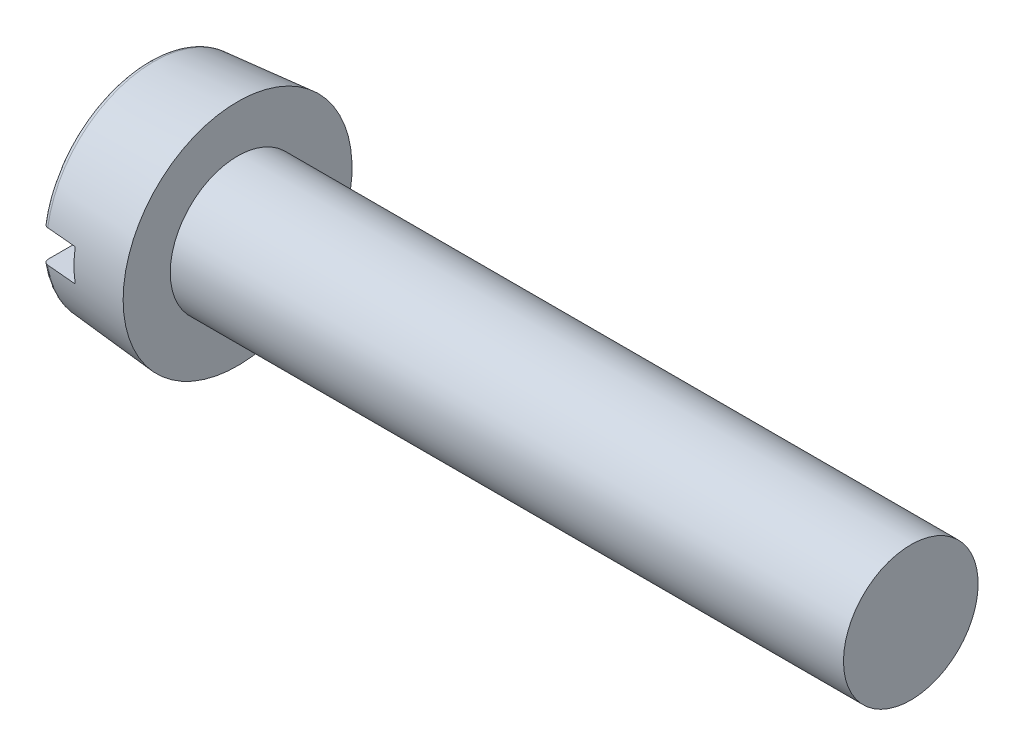
ISO-10303-21;
HEADER;
FILE_DESCRIPTION(('STEP AP214'),'2;1');
FILE_NAME('part.step','',(''),(''),'','','');
FILE_SCHEMA(('AUTOMOTIVE_DESIGN { 1 0 10303 214 1 1 1 1 }'));
ENDSEC;
DATA;
#1=APPLICATION_CONTEXT('core data for automotive mechanical design processes');
#2=APPLICATION_PROTOCOL_DEFINITION('international standard','automotive_design',2000,#1);
#3=PRODUCT_CONTEXT('',#1,'mechanical');
#4=PRODUCT('Part','Part','',(#3));
#5=PRODUCT_RELATED_PRODUCT_CATEGORY('part','',(#4));
#6=PRODUCT_DEFINITION_FORMATION('','',#4);
#7=PRODUCT_DEFINITION_CONTEXT('part definition',#1,'design');
#8=PRODUCT_DEFINITION('design','',#6,#7);
#9=PRODUCT_DEFINITION_SHAPE('','',#8);
#10=(LENGTH_UNIT() NAMED_UNIT(*) SI_UNIT(.MILLI.,.METRE.));
#11=(NAMED_UNIT(*) PLANE_ANGLE_UNIT() SI_UNIT($,.RADIAN.));
#12=(NAMED_UNIT(*) SI_UNIT($,.STERADIAN.) SOLID_ANGLE_UNIT());
#13=UNCERTAINTY_MEASURE_WITH_UNIT(LENGTH_MEASURE(1.E-05),#10,'distance_accuracy_value','');
#14=(GEOMETRIC_REPRESENTATION_CONTEXT(3) GLOBAL_UNCERTAINTY_ASSIGNED_CONTEXT((#13)) GLOBAL_UNIT_ASSIGNED_CONTEXT((#10,
#11,#12)) REPRESENTATION_CONTEXT('',''));
#15=CARTESIAN_POINT('',(0.,0.,0.));
#16=DIRECTION('',(0.,0.,1.));
#17=DIRECTION('',(1.,0.,0.));
#18=AXIS2_PLACEMENT_3D('',#15,#16,#17);
#19=CARTESIAN_POINT('',(0.,0.,0.));
#20=DIRECTION('',(-1.,0.,0.));
#21=DIRECTION('',(0.,0.,1.));
#22=AXIS2_PLACEMENT_3D('',#19,#20,#21);
#23=PLANE('',#22);
#24=DIRECTION('',(0.,0.,-1.));
#25=VECTOR('',#24,1.);
#26=CARTESIAN_POINT('',(0.,0.6,4.25));
#27=LINE('',#26,#25);
#28=CARTESIAN_POINT('',(0.,0.6,3.7300729219396));
#29=VERTEX_POINT('',#28);
#30=CARTESIAN_POINT('',(0.,0.6,-3.7300729219396));
#31=VERTEX_POINT('',#30);
#32=EDGE_CURVE('E107',#29,#31,#27,.T.);
#33=ORIENTED_EDGE('',*,*,#32,.F.);
#34=CARTESIAN_POINT('',(0.,0.,0.));
#35=DIRECTION('',(-1.,0.,0.));
#36=DIRECTION('',(0.,0.,1.));
#37=AXIS2_PLACEMENT_3D('',#34,#35,#36);
#38=CIRCLE('',#37,3.77802117556097);
#39=EDGE_CURVE('E109',#29,#31,#38,.T.);
#40=ORIENTED_EDGE('',*,*,#39,.T.);
#41=EDGE_LOOP('',(#33,#40));
#42=FACE_BOUND('',#41,.T.);
#43=ADVANCED_FACE('F38',(#42),#23,.T.);
#44=CARTESIAN_POINT('',(0.2,0.,0.));
#45=DIRECTION('',(-1.,0.,0.));
#46=DIRECTION('',(0.,0.,1.));
#47=AXIS2_PLACEMENT_3D('',#44,#45,#46);
#48=TOROIDAL_SURFACE('',#47,3.77802117556097,0.2);
#49=CARTESIAN_POINT('',(0.0612246387865015,0.6,-3.87587372657926));
#50=CARTESIAN_POINT('',(0.0692437686753912,0.6,-3.88369228056032));
#51=CARTESIAN_POINT('',(0.0779233060285452,0.6,-3.89084432861686));
#52=CARTESIAN_POINT('',(0.0963647371093723,0.6,-3.90359892074776));
#53=CARTESIAN_POINT('',(0.106127774849142,0.6,-3.90919980480116));
#54=CARTESIAN_POINT('',(0.126458056502604,0.6,-3.9186779090971));
#55=CARTESIAN_POINT('',(0.137025240149511,0.6,-3.9225552583614));
#56=CARTESIAN_POINT('',(0.158660455760603,0.6,-3.92846742757867));
#57=CARTESIAN_POINT('',(0.169728366633293,0.6,-3.93050269053124));
#58=CARTESIAN_POINT('',(0.191982910164277,0.6,-3.93266377300577));
#59=CARTESIAN_POINT('',(0.203168454374147,0.6,-3.93280080792452));
#60=CARTESIAN_POINT('',(0.22540313842355,0.6,-3.93119011051395));
#61=CARTESIAN_POINT('',(0.236452276636842,0.6,-3.92944235573598));
#62=CARTESIAN_POINT('',(0.258074076113257,0.6,-3.9241213274814));
#63=CARTESIAN_POINT('',(0.268647790704579,0.6,-3.92055233042282));
#64=CARTESIAN_POINT('',(0.289049953276454,0.6,-3.91169791603072));
#65=CARTESIAN_POINT('',(0.29887839185142,0.6,-3.90641247703967));
#66=CARTESIAN_POINT('',(0.317563075466742,0.6,-3.89425210131312));
#67=CARTESIAN_POINT('',(0.326414509930255,0.6,-3.88736977576277));
#68=CARTESIAN_POINT('',(0.342850589250194,0.6,-3.87223027231712));
#69=CARTESIAN_POINT('',(0.350435177228172,0.6,-3.86397303272459));
#70=CARTESIAN_POINT('',(0.364204576611067,0.6,-3.84623083323831));
#71=CARTESIAN_POINT('',(0.370374619979001,0.6,-3.83673441377611));
#72=CARTESIAN_POINT('',(0.381054006931012,0.6,-3.81684980557615));
#73=CARTESIAN_POINT('',(0.385563246202521,0.6,-3.80646156087472));
#74=CARTESIAN_POINT('',(0.392846737104488,0.6,-3.78495964541406));
#75=CARTESIAN_POINT('',(0.395600353250689,0.6,-3.77383898316558));
#76=CARTESIAN_POINT('',(0.399218897141943,0.6,-3.75129442345609));
#77=CARTESIAN_POINT('',(0.400083722775218,0.6,-3.7398705096345));
#78=CARTESIAN_POINT('',(0.399902741791213,0.6,-3.71694103114224));
#79=CARTESIAN_POINT('',(0.398840746719926,0.6,-3.70543559116921));
#80=CARTESIAN_POINT('',(0.394803369378344,0.6,-3.68276514513534));
#81=CARTESIAN_POINT('',(0.391827944203721,0.6,-3.67160014671402));
#82=CARTESIAN_POINT('',(0.384037460739286,0.6,-3.64991355445128));
#83=CARTESIAN_POINT('',(0.379219862757466,0.6,-3.63939287222453));
#84=CARTESIAN_POINT('',(0.367874839392101,0.6,-3.61931729960695));
#85=CARTESIAN_POINT('',(0.361347459439158,0.6,-3.60976238356411));
#86=CARTESIAN_POINT('',(0.346813106724987,0.6,-3.59196475602931));
#87=CARTESIAN_POINT('',(0.338816832744861,0.6,-3.58371331095396));
#88=CARTESIAN_POINT('',(0.321536640605144,0.6,-3.56869120707094));
#89=CARTESIAN_POINT('',(0.312252811605285,0.6,-3.56192044581347));
#90=CARTESIAN_POINT('',(0.292787711529982,0.6,-3.55014520859649));
#91=CARTESIAN_POINT('',(0.282619437412489,0.6,-3.54511924945517));
#92=CARTESIAN_POINT('',(0.261575984908415,0.6,-3.53687075764736));
#93=CARTESIAN_POINT('',(0.250700861851134,0.6,-3.5336480840162));
#94=CARTESIAN_POINT('',(0.228699522013635,0.6,-3.52913644836644));
#95=CARTESIAN_POINT('',(0.217578184290445,0.6,-3.52782367294734));
#96=CARTESIAN_POINT('',(0.195273841652058,0.6,-3.52709644901578));
#97=CARTESIAN_POINT('',(0.184090839563993,0.6,-3.52768191418516));
#98=CARTESIAN_POINT('',(0.162051417581182,0.6,-3.53072340997975));
#99=CARTESIAN_POINT('',(0.151193435259432,0.6,-3.53316814215366));
#100=CARTESIAN_POINT('',(0.130039848472246,0.6,-3.53983958577619));
#101=CARTESIAN_POINT('',(0.119744247211512,0.6,-3.5440663073782));
#102=CARTESIAN_POINT('',(0.0999656304850377,0.6,-3.55419219099659));
#103=CARTESIAN_POINT('',(0.0904856235137145,0.6,-3.56009722590129));
#104=CARTESIAN_POINT('',(0.0726372332701148,0.6,-3.57339845811737));
#105=CARTESIAN_POINT('',(0.0642689096237832,0.6,-3.58079473535911));
#106=CARTESIAN_POINT('',(0.0487797657085489,0.6,-3.59695536738271));
#107=CARTESIAN_POINT('',(0.041673965321641,0.6,-3.60573411527005));
#108=CARTESIAN_POINT('',(0.0290139060780257,0.6,-3.62434680769462));
#109=CARTESIAN_POINT('',(0.0234597605199496,0.6,-3.63418082921323));
#110=CARTESIAN_POINT('',(0.0139840285365265,0.6,-3.6547658519114));
#111=CARTESIAN_POINT('',(0.0100852096750154,0.6,-3.66552733588691));
#112=CARTESIAN_POINT('',(0.00413087259760239,0.6,-3.68754837921726));
#113=CARTESIAN_POINT('',(0.0020753916043561,0.6,-3.69880794862515));
#114=CARTESIAN_POINT('',(-0.0001485685664027,0.6,-3.72161689691355));
#115=CARTESIAN_POINT('',(-0.000299506711232251,0.6,-3.73316798931618));
#116=CARTESIAN_POINT('',(0.00133685743644255,0.6,-3.75613545547462));
#117=CARTESIAN_POINT('',(0.00312467379249925,0.6,-3.76755179268835));
#118=CARTESIAN_POINT('',(0.00859806058197772,0.6,-3.78994282374299));
#119=CARTESIAN_POINT('',(0.0122872838347024,0.6,-3.800916623506));
#120=CARTESIAN_POINT('',(0.0214659155654678,0.6,-3.82207324823008));
#121=CARTESIAN_POINT('',(0.0269531292978248,0.6,-3.83225701890213));
#122=CARTESIAN_POINT('',(0.0372850957105776,0.6,-3.84804615301513));
#123=CARTESIAN_POINT('',(0.0416441542615394,0.6,-3.85397505001525));
#124=CARTESIAN_POINT('',(0.0509821850624984,0.6,-3.86532291935009));
#125=CARTESIAN_POINT('',(0.0559611547765462,0.6,-3.87074189377065));
#126=CARTESIAN_POINT('',(0.0612246387865015,0.6,-3.87587372657926));
#127=B_SPLINE_CURVE_WITH_KNOTS('',3,(#49,#50,#51,#52,#53,#54,#55,#56,#57,#58,#59,#60,#61,#62,
#63,#64,#65,#66,#67,#68,#69,#70,#71,#72,#73,#74,#75,#76,#77,#78,#79,#80,#81,#82,#83,#84,#85,#86,
#87,#88,#89,#90,#91,#92,#93,#94,#95,#96,#97,#98,#99,#100,#101,#102,#103,#104,#105,#106,#107,
#108,#109,#110,#111,#112,#113,#114,#115,#116,#117,#118,#119,#120,#121,#122,#123,#124,#125,#126),
.UNSPECIFIED.,.T.,.F.,(4,2,2,2,2,2,2,2,2,2,2,2,2,2,2,2,2,2,2,2,2,2,2,2,2,2,2,2,2,2,2,2,2,2,2,2,
2,2,4),(0.,0.0335730171484836,0.067181825760315,0.100788118032968,0.134386326247554,
0.16778593922068,0.201185950002037,0.23450789338553,0.267830257231098,0.301309992165475,
0.334791229857928,0.368607534834798,0.402425963400057,0.43663489980734,0.470845685572107,
0.50534523014942,0.539845548327716,0.574393602495696,0.608940738780752,0.643245565962143,
0.677548018811245,0.711411743681506,0.745272821019978,0.778707975040933,0.812141608695966,
0.845373679321568,0.878605939298827,0.911955951073588,0.945307750878941,0.979033047184368,
1.01276080539804,1.04693850769677,1.08111690013278,1.11560985168408,1.15011195132798,
1.18468058187836,1.21920717190366,1.24124344818911,1.26327963433093),.UNSPECIFIED.);
#128=CARTESIAN_POINT('',(0.182568851450474,0.6,-3.93174236488051));
#129=VERTEX_POINT('',#128);
#130=EDGE_CURVE('E62',#31,#129,#127,.T.);
#131=ORIENTED_EDGE('',*,*,#130,.F.);
#132=ORIENTED_EDGE('',*,*,#39,.F.);
#133=CARTESIAN_POINT('',(0.153019204720444,0.6,3.53303185592631));
#134=CARTESIAN_POINT('',(0.163787699092,0.6,3.53039273084238));
#135=CARTESIAN_POINT('',(0.174786369480569,0.6,3.52865997691216));
#136=CARTESIAN_POINT('',(0.196927139373086,0.6,3.52706644904759));
#137=CARTESIAN_POINT('',(0.20806938646626,0.6,3.52720778568122));
#138=CARTESIAN_POINT('',(0.230166793925918,0.6,3.52936085221014));
#139=CARTESIAN_POINT('',(0.241122046646135,0.6,3.53137162989673));
#140=CARTESIAN_POINT('',(0.262537605802998,0.6,3.53719997516225));
#141=CARTESIAN_POINT('',(0.272998019743045,0.6,3.54101714830167));
#142=CARTESIAN_POINT('',(0.293156907074368,0.6,3.55035209768921));
#143=CARTESIAN_POINT('',(0.302853712802607,0.6,3.55587347320583));
#144=CARTESIAN_POINT('',(0.321195782787508,0.6,3.56844988525001));
#145=CARTESIAN_POINT('',(0.329840963247542,0.6,3.5755050438693));
#146=CARTESIAN_POINT('',(0.345933181784514,0.6,3.59102589791574));
#147=CARTESIAN_POINT('',(0.353366652206714,0.6,3.59950565727422));
#148=CARTESIAN_POINT('',(0.366727107894518,0.6,3.61757863289314));
#149=CARTESIAN_POINT('',(0.372653988326806,0.6,3.62717192656921));
#150=CARTESIAN_POINT('',(0.382915984541161,0.6,3.64733777490785));
#151=CARTESIAN_POINT('',(0.387228687602212,0.6,3.65792173686799));
#152=CARTESIAN_POINT('',(0.394036122111021,0.6,3.67965904041595));
#153=CARTESIAN_POINT('',(0.396530745128449,0.6,3.69081241592117));
#154=CARTESIAN_POINT('',(0.399652277896823,0.6,3.71349213245068));
#155=CARTESIAN_POINT('',(0.400260171320127,0.6,3.72502109478211));
#156=CARTESIAN_POINT('',(0.39953720366488,0.6,3.74801834733382));
#157=CARTESIAN_POINT('',(0.398206290301471,0.6,3.7594866359095));
#158=CARTESIAN_POINT('',(0.393633461516549,0.6,3.78206556000447));
#159=CARTESIAN_POINT('',(0.390386850559507,0.6,3.7931752457468));
#160=CARTESIAN_POINT('',(0.382064132667235,0.6,3.8146871645281));
#161=CARTESIAN_POINT('',(0.376988063245644,0.6,3.82508941206812));
#162=CARTESIAN_POINT('',(0.365177274214925,0.6,3.84482560070898));
#163=CARTESIAN_POINT('',(0.358452111344946,0.6,3.85416525859618));
#164=CARTESIAN_POINT('',(0.343513339344314,0.6,3.87156715868567));
#165=CARTESIAN_POINT('',(0.335299812917085,0.6,3.87962947181914));
#166=CARTESIAN_POINT('',(0.317712230470067,0.6,3.89415347977617));
#167=CARTESIAN_POINT('',(0.30835173547522,0.6,3.90063159470799));
#168=CARTESIAN_POINT('',(0.288666107436056,0.6,3.91190330326435));
#169=CARTESIAN_POINT('',(0.278341037742608,0.6,3.91669700741848));
#170=CARTESIAN_POINT('',(0.257144782644673,0.6,3.92440870216056));
#171=CARTESIAN_POINT('',(0.246281069204201,0.6,3.92734723639224));
#172=CARTESIAN_POINT('',(0.224213189898419,0.6,3.93134392354523));
#173=CARTESIAN_POINT('',(0.213009040493183,0.6,3.93240216723189));
#174=CARTESIAN_POINT('',(0.190664464789265,0.6,3.93260524563386));
#175=CARTESIAN_POINT('',(0.179524160616769,0.6,3.93176380416237));
#176=CARTESIAN_POINT('',(0.157543493084992,0.6,3.9282213570788));
#177=CARTESIAN_POINT('',(0.146703125545544,0.6,3.9255203773964));
#178=CARTESIAN_POINT('',(0.125633620376287,0.6,3.91834194214552));
#179=CARTESIAN_POINT('',(0.115404195642637,0.6,3.91386532869004));
#180=CARTESIAN_POINT('',(0.0958356078992517,0.6,3.90326869695395));
#181=CARTESIAN_POINT('',(0.0864964665385028,0.6,3.89714863872356));
#182=CARTESIAN_POINT('',(0.0689078244739585,0.6,3.88340020659638));
#183=CARTESIAN_POINT('',(0.0606656220467727,0.6,3.87576249873378));
#184=CARTESIAN_POINT('',(0.0455636965496512,0.6,3.85922496642767));
#185=CARTESIAN_POINT('',(0.0387040443145728,0.6,3.8503250773562));
#186=CARTESIAN_POINT('',(0.0264820753878567,0.6,3.83141338915928));
#187=CARTESIAN_POINT('',(0.0211367692801702,0.6,3.8213905975586));
#188=CARTESIAN_POINT('',(0.0121833105423785,0.6,3.80059707912202));
#189=CARTESIAN_POINT('',(0.00857526961113825,0.6,3.78982630424487));
#190=CARTESIAN_POINT('',(0.00315846688864244,0.6,3.76771337468533));
#191=CARTESIAN_POINT('',(0.00137029351318383,0.6,3.75636617446343));
#192=CARTESIAN_POINT('',(-0.000290112943638664,0.6,3.73353228057242));
#193=CARTESIAN_POINT('',(-0.000162250499358966,0.6,3.72204557997692));
#194=CARTESIAN_POINT('',(0.00201253267634337,0.6,3.69917443745036));
#195=CARTESIAN_POINT('',(0.00407276664696118,0.6,3.68779125858993));
#196=CARTESIAN_POINT('',(0.0100762356068624,0.6,3.66553285272385));
#197=CARTESIAN_POINT('',(0.0140194185135757,0.6,3.65465761167773));
#198=CARTESIAN_POINT('',(0.0236788317583957,0.6,3.63373689590963));
#199=CARTESIAN_POINT('',(0.0293934411359974,0.6,3.62369067318522));
#200=CARTESIAN_POINT('',(0.0424442621729547,0.6,3.60470884287376));
#201=CARTESIAN_POINT('',(0.0497808153060219,0.6,3.59577346977774));
#202=CARTESIAN_POINT('',(0.0658018522999086,0.6,3.57935500006869));
#203=CARTESIAN_POINT('',(0.0744744316883453,0.6,3.57186027802978));
#204=CARTESIAN_POINT('',(0.0929628353468952,0.6,3.55846476458913));
#205=CARTESIAN_POINT('',(0.102777159407983,0.6,3.55256191464308));
#206=CARTESIAN_POINT('',(0.11939976782158,0.6,3.54441833895507));
#207=CARTESIAN_POINT('',(0.125948294334595,0.6,3.54163562452137));
#208=CARTESIAN_POINT('',(0.139306080198114,0.6,3.53678837981902));
#209=CARTESIAN_POINT('',(0.146115337688668,0.6,3.53472384442823));
#210=CARTESIAN_POINT('',(0.153019204720444,0.6,3.53303185592631));
#211=B_SPLINE_CURVE_WITH_KNOTS('',3,(#133,#134,#135,#136,#137,#138,#139,#140,#141,#142,#143,
#144,#145,#146,#147,#148,#149,#150,#151,#152,#153,#154,#155,#156,#157,#158,#159,#160,#161,#162,
#163,#164,#165,#166,#167,#168,#169,#170,#171,#172,#173,#174,#175,#176,#177,#178,#179,#180,#181,
#182,#183,#184,#185,#186,#187,#188,#189,#190,#191,#192,#193,#194,#195,#196,#197,#198,#199,#200,
#201,#202,#203,#204,#205,#206,#207,#208,#209,#210),.UNSPECIFIED.,.T.,.F.,(4,2,2,2,2,2,2,2,2,2,2,
2,2,2,2,2,2,2,2,2,2,2,2,2,2,2,2,2,2,2,2,2,2,2,2,2,2,2,4),(0.,0.0332356095929416,
0.0665086517232946,0.0997647553509098,0.133013600616347,0.166333153445218,0.199655359538419,
0.233328270524307,0.267003523937312,0.301130388223696,0.33525928767045,0.369731073046334,
0.404203788058835,0.438761351648743,0.473318206664932,0.507679345757125,0.542038576099973,
0.576024948173823,0.610009089674461,0.64360997584809,0.677209239996526,0.71056655177661,
0.743923398426849,0.777264444120806,0.810606300360985,0.844159945848459,0.877715310017723,
0.911633872437314,0.945554615387104,0.979854980118833,1.01415705493097,1.04869720641275,
1.08323640256555,1.11774408613687,1.15225904166647,1.18648256602634,1.22066161935541,
1.24196969251522,1.26327761370017),.UNSPECIFIED.);
#212=CARTESIAN_POINT('',(0.182568851450481,0.6,3.93174236488095));
#213=VERTEX_POINT('',#212);
#214=EDGE_CURVE('E99',#213,#29,#211,.T.);
#215=ORIENTED_EDGE('',*,*,#214,.F.);
#216=CARTESIAN_POINT('',(0.182568851450474,0.,0.));
#217=DIRECTION('',(-1.,0.,0.));
#218=DIRECTION('',(0.,0.,1.));
#219=AXIS2_PLACEMENT_3D('',#216,#217,#218);
#220=CIRCLE('',#219,3.97726011517932);
#221=EDGE_CURVE('E113',#129,#213,#220,.F.);
#222=ORIENTED_EDGE('',*,*,#221,.F.);
#223=EDGE_LOOP('',(#131,#132,#215,#222));
#224=FACE_BOUND('',#223,.T.);
#225=ADVANCED_FACE('F184',(#224),#48,.T.);
#226=CARTESIAN_POINT('',(-25.4,0.,0.));
#227=DIRECTION('',(-1.,0.,0.));
#228=DIRECTION('',(0.,0.,1.));
#229=AXIS2_PLACEMENT_3D('',#226,#227,#228);
#230=CYLINDRICAL_SURFACE('',#229,2.5);
#231=CARTESIAN_POINT('',(28.3,0.,0.));
#232=DIRECTION('',(-1.,0.,0.));
#233=DIRECTION('',(0.,0.,1.));
#234=AXIS2_PLACEMENT_3D('',#231,#232,#233);
#235=CIRCLE('',#234,2.5);
#236=CARTESIAN_POINT('',(28.3,0.,2.5));
#237=VERTEX_POINT('',#236);
#238=EDGE_CURVE('E110',#237,#237,#235,.T.);
#239=ORIENTED_EDGE('',*,*,#238,.T.);
#240=EDGE_LOOP('',(#239));
#241=FACE_BOUND('',#240,.T.);
#242=CARTESIAN_POINT('',(3.3,0.,0.));
#243=DIRECTION('',(-1.,0.,0.));
#244=DIRECTION('',(0.,0.,1.));
#245=AXIS2_PLACEMENT_3D('',#242,#243,#244);
#246=CIRCLE('',#245,2.5);
#247=CARTESIAN_POINT('',(3.3,0.,2.5));
#248=VERTEX_POINT('',#247);
#249=EDGE_CURVE('E171',#248,#248,#246,.T.);
#250=ORIENTED_EDGE('',*,*,#249,.F.);
#251=EDGE_LOOP('',(#250));
#252=FACE_BOUND('',#251,.T.);
#253=ADVANCED_FACE('F181',(#241,#252),#230,.T.);
#254=CARTESIAN_POINT('',(28.3,2.5,0.));
#255=DIRECTION('',(1.,0.,0.));
#256=DIRECTION('',(0.,0.,-1.));
#257=AXIS2_PLACEMENT_3D('',#254,#255,#256);
#258=PLANE('',#257);
#259=ORIENTED_EDGE('',*,*,#238,.F.);
#260=EDGE_LOOP('',(#259));
#261=FACE_BOUND('',#260,.T.);
#262=ADVANCED_FACE('F183',(#261),#258,.T.);
#263=DIRECTION('',(0.,0.,1.));
#264=VECTOR('',#263,1.);
#265=CARTESIAN_POINT('',(0.,-0.599999999999999,-4.25));
#266=LINE('',#265,#264);
#267=CARTESIAN_POINT('',(0.,-0.599999999999999,-3.7300729219396));
#268=VERTEX_POINT('',#267);
#269=CARTESIAN_POINT('',(0.,-0.6,3.7300729219396));
#270=VERTEX_POINT('',#269);
#271=EDGE_CURVE('E54',#268,#270,#266,.T.);
#272=ORIENTED_EDGE('',*,*,#271,.F.);
#273=EDGE_CURVE('E105',#268,#270,#38,.T.);
#274=ORIENTED_EDGE('',*,*,#273,.T.);
#275=EDGE_LOOP('',(#272,#274));
#276=FACE_BOUND('',#275,.T.);
#277=ADVANCED_FACE('F104',(#276),#23,.T.);
#278=CARTESIAN_POINT('',(0.,0.,0.));
#279=DIRECTION('',(1.,0.,0.));
#280=DIRECTION('',(0.,0.,-1.));
#281=AXIS2_PLACEMENT_3D('',#278,#279,#280);
#282=CONICAL_SURFACE('',#281,3.96128741036445,0.0872664625997166);
#283=CARTESIAN_POINT('',(-6.6953629941866,0.6,-3.32176592464648));
#284=CARTESIAN_POINT('',(-4.63355446277594,0.6,-3.50505064447264));
#285=CARTESIAN_POINT('',(-2.5717078336292,0.6,-3.68790585738393));
#286=CARTESIAN_POINT('',(-0.116158834434021,0.6,-3.9053064156285));
#287=CARTESIAN_POINT('',(0.277517217005228,0.6,-3.94014895660471));
#288=CARTESIAN_POINT('',(3.12675511362268,0.6,-4.19224663881475));
#289=CARTESIAN_POINT('',(5.58235185834516,0.6,-4.40910750153656));
#290=CARTESIAN_POINT('',(8.0379662088826,0.6,-4.62576818100486));
#291=B_SPLINE_CURVE_WITH_KNOTS('',3,(#283,#284,#285,#286,#287,#288,#289,#290),.UNSPECIFIED.,.F.,
.F.,(4,2,2,4),(0.,6.20981701810184,7.39546178957629,14.790923493951),.UNSPECIFIED.);
#292=CARTESIAN_POINT('',(1.3,0.6,-4.03060910844025));
#293=VERTEX_POINT('',#292);
#294=EDGE_CURVE('E166',#129,#293,#291,.T.);
#295=ORIENTED_EDGE('',*,*,#294,.F.);
#296=ORIENTED_EDGE('',*,*,#221,.T.);
#297=CARTESIAN_POINT('',(8.0379662088826,0.6,4.62576818100486));
#298=CARTESIAN_POINT('',(6.81015816075401,0.6,4.51744744974704));
#299=CARTESIAN_POINT('',(5.58235534195936,0.6,4.40906739926456));
#300=CARTESIAN_POINT('',(3.12676355068113,0.6,4.1921509439523));
#301=CARTESIAN_POINT('',(1.89897457819717,0.6,4.0836145391268));
#302=CARTESIAN_POINT('',(-0.55658621496665,0.6,3.86634765198338));
#303=CARTESIAN_POINT('',(-1.7843580356463,0.6,3.75761716966308));
#304=CARTESIAN_POINT('',(-4.23987895857219,0.6,3.53989961582312));
#305=CARTESIAN_POINT('',(-5.4676280608178,0.6,3.43091254429639));
#306=CARTESIAN_POINT('',(-6.6953629941866,0.6,3.32176592464648));
#307=B_SPLINE_CURVE_WITH_KNOTS('',3,(#297,#298,#299,#300,#301,#302,#303,#304,#305,#306),
.UNSPECIFIED.,.F.,.F.,(4,2,2,2,4),(0.,3.69773091023337,7.39546171936673,11.0931925737077,
14.7909235299972),.UNSPECIFIED.);
#308=CARTESIAN_POINT('',(1.3,0.6,4.03060910844025));
#309=VERTEX_POINT('',#308);
#310=EDGE_CURVE('E162',#309,#213,#307,.T.);
#311=ORIENTED_EDGE('',*,*,#310,.F.);
#312=CARTESIAN_POINT('',(1.3,0.,0.));
#313=DIRECTION('',(-1.,0.,0.));
#314=DIRECTION('',(0.,0.,1.));
#315=AXIS2_PLACEMENT_3D('',#312,#313,#314);
#316=CIRCLE('',#315,4.07502267294815);
#317=CARTESIAN_POINT('',(1.3,-0.6,4.03060910844025));
#318=VERTEX_POINT('',#317);
#319=EDGE_CURVE('E43',#309,#318,#316,.F.);
#320=ORIENTED_EDGE('',*,*,#319,.T.);
#321=CARTESIAN_POINT('',(-6.6953629941866,-0.6,3.32176592464648));
#322=CARTESIAN_POINT('',(-4.63355446277595,-0.6,3.50505064447264));
#323=CARTESIAN_POINT('',(-2.5717078336292,-0.6,3.68790585738393));
#324=CARTESIAN_POINT('',(-0.116158834434021,-0.6,3.9053064156285));
#325=CARTESIAN_POINT('',(0.277517217005228,-0.6,3.94014895660471));
#326=CARTESIAN_POINT('',(3.12675511362268,-0.6,4.19224663881475));
#327=CARTESIAN_POINT('',(5.58235185834516,-0.6,4.40910750153656));
#328=CARTESIAN_POINT('',(8.0379662088826,-0.6,4.62576818100486));
#329=B_SPLINE_CURVE_WITH_KNOTS('',3,(#321,#322,#323,#324,#325,#326,#327,#328),.UNSPECIFIED.,.F.,
.F.,(4,2,2,4),(0.,6.20981701810184,7.39546178957629,14.790923493951),.UNSPECIFIED.);
#330=CARTESIAN_POINT('',(0.182568851450073,-0.6,3.93174236488233));
#331=VERTEX_POINT('',#330);
#332=EDGE_CURVE('E140',#331,#318,#329,.T.);
#333=ORIENTED_EDGE('',*,*,#332,.F.);
#334=CARTESIAN_POINT('',(0.182568851443687,-0.599999999999999,-3.93174236490716));
#335=VERTEX_POINT('',#334);
#336=EDGE_CURVE('E119',#331,#335,#220,.F.);
#337=ORIENTED_EDGE('',*,*,#336,.T.);
#338=CARTESIAN_POINT('',(8.0379662088826,-0.599999999999999,-4.62576818100486));
#339=CARTESIAN_POINT('',(6.81015816075401,-0.599999999999999,-4.51744744974704));
#340=CARTESIAN_POINT('',(5.58235534195936,-0.599999999999999,-4.40906739926456));
#341=CARTESIAN_POINT('',(3.12676355068113,-0.599999999999999,-4.1921509439523));
#342=CARTESIAN_POINT('',(1.89897457819717,-0.599999999999999,-4.0836145391268));
#343=CARTESIAN_POINT('',(-0.55658621496665,-0.599999999999999,-3.86634765198338));
#344=CARTESIAN_POINT('',(-1.7843580356463,-0.6,-3.75761716966308));
#345=CARTESIAN_POINT('',(-4.23987895857219,-0.6,-3.53989961582312));
#346=CARTESIAN_POINT('',(-5.4676280608178,-0.6,-3.43091254429639));
#347=CARTESIAN_POINT('',(-6.6953629941866,-0.6,-3.32176592464648));
#348=B_SPLINE_CURVE_WITH_KNOTS('',3,(#338,#339,#340,#341,#342,#343,#344,#345,#346,#347),
.UNSPECIFIED.,.F.,.F.,(4,2,2,2,4),(0.,3.69773091023337,7.39546171936673,11.0931925737077,
14.7909235299972),.UNSPECIFIED.);
#349=CARTESIAN_POINT('',(1.3,-0.599999999999999,-4.03060910844025));
#350=VERTEX_POINT('',#349);
#351=EDGE_CURVE('E94',#350,#335,#348,.T.);
#352=ORIENTED_EDGE('',*,*,#351,.F.);
#353=EDGE_CURVE('E11',#350,#293,#316,.F.);
#354=ORIENTED_EDGE('',*,*,#353,.T.);
#355=EDGE_LOOP('',(#295,#296,#311,#320,#333,#337,#352,#354));
#356=FACE_BOUND('',#355,.T.);
#357=CARTESIAN_POINT('',(3.3,0.,0.));
#358=DIRECTION('',(-1.,0.,0.));
#359=DIRECTION('',(0.,0.,1.));
#360=AXIS2_PLACEMENT_3D('',#357,#358,#359);
#361=CIRCLE('',#360,4.25);
#362=CARTESIAN_POINT('',(3.3,0.,4.25));
#363=VERTEX_POINT('',#362);
#364=EDGE_CURVE('E115',#363,#363,#361,.T.);
#365=ORIENTED_EDGE('',*,*,#364,.T.);
#366=EDGE_LOOP('',(#365));
#367=FACE_BOUND('',#366,.T.);
#368=ADVANCED_FACE('F151',(#356,#367),#282,.T.);
#369=CARTESIAN_POINT('',(3.3,2.5,0.));
#370=DIRECTION('',(-1.,0.,0.));
#371=DIRECTION('',(0.,0.,1.));
#372=AXIS2_PLACEMENT_3D('',#369,#370,#371);
#373=PLANE('',#372);
#374=ORIENTED_EDGE('',*,*,#364,.F.);
#375=EDGE_LOOP('',(#374));
#376=FACE_BOUND('',#375,.T.);
#377=ORIENTED_EDGE('',*,*,#249,.T.);
#378=EDGE_LOOP('',(#377));
#379=FACE_BOUND('',#378,.T.);
#380=ADVANCED_FACE('F155',(#376,#379),#373,.F.);
#381=CARTESIAN_POINT('',(0.0612246387865015,-0.599999999999999,-3.87587372657926));
#382=CARTESIAN_POINT('',(0.0530711976450406,-0.599999999999999,-3.86792280762262));
#383=CARTESIAN_POINT('',(0.0455887379957456,-0.599999999999999,-3.85927102386718));
#384=CARTESIAN_POINT('',(0.0321806512251617,-0.599999999999999,-3.84082362473679));
#385=CARTESIAN_POINT('',(0.0262571384681247,-0.599999999999999,-3.83102648166499));
#386=CARTESIAN_POINT('',(0.0161389190057642,-0.599999999999999,-3.81058767368617));
#387=CARTESIAN_POINT('',(0.011942585398122,-0.599999999999999,-3.79994681483285));
#388=CARTESIAN_POINT('',(0.00538206263770567,-0.599999999999999,-3.77811831933608));
#389=CARTESIAN_POINT('',(0.00301741026230065,-0.6,-3.76693082169606));
#390=CARTESIAN_POINT('',(0.000167180482523056,-0.6,-3.74423216709237));
#391=CARTESIAN_POINT('',(-0.000303940667364836,-0.6,-3.73271919340792));
#392=CARTESIAN_POINT('',(0.000683726705495547,-0.6,-3.70977556429028));
#393=CARTESIAN_POINT('',(0.00214267185113321,-0.6,-3.69834491561337));
#394=CARTESIAN_POINT('',(0.00696250177491505,-0.6,-3.675837355522));
#395=CARTESIAN_POINT('',(0.0103319544175529,-0.6,-3.66476227675151));
#396=CARTESIAN_POINT('',(0.0188891089899413,-0.6,-3.64333795432693));
#397=CARTESIAN_POINT('',(0.0240767958072676,-0.6,-3.63298870464089));
#398=CARTESIAN_POINT('',(0.036107574387182,-0.6,-3.61335493055711));
#399=CARTESIAN_POINT('',(0.0429443641765551,-0.6,-3.60406654659607));
#400=CARTESIAN_POINT('',(0.0580963458354466,-0.6,-3.58678561929948));
#401=CARTESIAN_POINT('',(0.0664114532512698,-0.6,-3.5787930019889));
#402=CARTESIAN_POINT('',(0.0841872598108014,-0.6,-3.56442741178723));
#403=CARTESIAN_POINT('',(0.0936342538579885,-0.6,-3.55803748408921));
#404=CARTESIAN_POINT('',(0.113478580170525,-0.6,-3.54695976893771));
#405=CARTESIAN_POINT('',(0.12387583768444,-0.6,-3.54227184774175));
#406=CARTESIAN_POINT('',(0.145174702216047,-0.6,-3.53479638138964));
#407=CARTESIAN_POINT('',(0.156067613717296,-0.6,-3.53198405383935));
#408=CARTESIAN_POINT('',(0.178172416916406,-0.6,-3.52824718676133));
#409=CARTESIAN_POINT('',(0.189384288443707,-0.6,-3.52732252812808));
#410=CARTESIAN_POINT('',(0.211698228430036,-0.6,-3.52738957853483));
#411=CARTESIAN_POINT('',(0.222800354286506,-0.6,-3.52836366044842));
#412=CARTESIAN_POINT('',(0.244682915641551,-0.6,-3.53216284383949));
#413=CARTESIAN_POINT('',(0.255463355811905,-0.6,-3.53498791842168));
#414=CARTESIAN_POINT('',(0.276395761222625,-0.6,-3.54240124953701));
#415=CARTESIAN_POINT('',(0.286547911619062,-0.6,-3.54698898371644));
#416=CARTESIAN_POINT('',(0.305947011219852,-0.6,-3.55778959312964));
#417=CARTESIAN_POINT('',(0.315193927562712,-0.6,-3.56400252733081));
#418=CARTESIAN_POINT('',(0.332608451007628,-0.6,-3.57793164811831));
#419=CARTESIAN_POINT('',(0.340765987545262,-0.6,-3.58566042099996));
#420=CARTESIAN_POINT('',(0.355688565917221,-0.6,-3.60236185910125));
#421=CARTESIAN_POINT('',(0.362453514055312,-0.6,-3.61133460795024));
#422=CARTESIAN_POINT('',(0.374493937007903,-0.6,-3.63039654897396));
#423=CARTESIAN_POINT('',(0.37974847924742,-0.6,-3.6404989636843));
#424=CARTESIAN_POINT('',(0.388509259811764,-0.6,-3.66143536718912));
#425=CARTESIAN_POINT('',(0.392015381019076,-0.6,-3.672269404936));
#426=CARTESIAN_POINT('',(0.397218136605891,-0.6,-3.694495858371));
#427=CARTESIAN_POINT('',(0.398893426557174,-0.6,-3.70589327430758));
#428=CARTESIAN_POINT('',(0.400316993848159,-0.6,-3.72880804529777));
#429=CARTESIAN_POINT('',(0.400065197620033,-0.6,-3.74032540491356));
#430=CARTESIAN_POINT('',(0.397633767633068,-0.6,-3.76321115664729));
#431=CARTESIAN_POINT('',(0.395444892511614,-0.599999999999999,-3.7745785692314));
#432=CARTESIAN_POINT('',(0.389183095172378,-0.599999999999999,-3.79678239965914));
#433=CARTESIAN_POINT('',(0.385110189095826,-0.599999999999999,-3.80761882205109));
#434=CARTESIAN_POINT('',(0.375206573065518,-0.599999999999999,-3.82840914801792));
#435=CARTESIAN_POINT('',(0.369382191477239,-0.599999999999999,-3.83836606457008));
#436=CARTESIAN_POINT('',(0.356128740094177,-0.599999999999999,-3.85714793934094));
#437=CARTESIAN_POINT('',(0.348699744186296,-0.599999999999999,-3.86597294965015));
#438=CARTESIAN_POINT('',(0.332524792429321,-0.599999999999999,-3.88214598632183));
#439=CARTESIAN_POINT('',(0.323792527999674,-0.599999999999999,-3.88950770349083));
#440=CARTESIAN_POINT('',(0.305203670719181,-0.599999999999999,-3.90263992696313));
#441=CARTESIAN_POINT('',(0.295347149539471,-0.599999999999999,-3.90841053461928));
#442=CARTESIAN_POINT('',(0.274913068891446,-0.599999999999999,-3.91812658059932));
#443=CARTESIAN_POINT('',(0.26434523714868,-0.599999999999999,-3.92209248094068));
#444=CARTESIAN_POINT('',(0.242690830063276,-0.599999999999999,-3.92817599531224));
#445=CARTESIAN_POINT('',(0.23160430449198,-0.599999999999999,-3.93029378629636));
#446=CARTESIAN_POINT('',(0.209331566863978,-0.599999999999999,-3.93260618794846));
#447=CARTESIAN_POINT('',(0.19814709281713,-0.599999999999999,-3.93281757285148));
#448=CARTESIAN_POINT('',(0.175899297397013,-0.599999999999999,-3.93135426522648));
#449=CARTESIAN_POINT('',(0.164836004418539,-0.599999999999999,-3.92967913981513));
#450=CARTESIAN_POINT('',(0.143171218072548,-0.599999999999999,-3.92449903651235));
#451=CARTESIAN_POINT('',(0.132568851437748,-0.599999999999999,-3.92099769829996));
#452=CARTESIAN_POINT('',(0.112108290216579,-0.599999999999999,-3.91227407425816));
#453=CARTESIAN_POINT('',(0.102249211642024,-0.599999999999999,-3.90705387364628));
#454=CARTESIAN_POINT('',(0.0872110287676747,-0.599999999999999,-3.89740723007418));
#455=CARTESIAN_POINT('',(0.0817113224276851,-0.599999999999999,-3.89347066798105));
#456=CARTESIAN_POINT('',(0.0711372053231181,-0.599999999999999,-3.88506290485178));
#457=CARTESIAN_POINT('',(0.0660627926499453,-0.599999999999999,-3.88059170621517));
#458=CARTESIAN_POINT('',(0.0612246387865015,-0.599999999999999,-3.87587372657926));
#459=B_SPLINE_CURVE_WITH_KNOTS('',3,(#381,#382,#383,#384,#385,#386,#387,#388,#389,#390,#391,
#392,#393,#394,#395,#396,#397,#398,#399,#400,#401,#402,#403,#404,#405,#406,#407,#408,#409,#410,
#411,#412,#413,#414,#415,#416,#417,#418,#419,#420,#421,#422,#423,#424,#425,#426,#427,#428,#429,
#430,#431,#432,#433,#434,#435,#436,#437,#438,#439,#440,#441,#442,#443,#444,#445,#446,#447,#448,
#449,#450,#451,#452,#453,#454,#455,#456,#457,#458),.UNSPECIFIED.,.T.,.F.,(4,2,2,2,2,2,2,2,2,2,2,
2,2,2,2,2,2,2,2,2,2,2,2,2,2,2,2,2,2,2,2,2,2,2,2,2,2,2,4),(0.,0.0341401968455438,
0.0683264613854141,0.102480450348528,0.136625799123466,0.171031342607164,0.205439678236503,
0.240003556014941,0.274567146519273,0.309000690023091,0.343432267030639,0.37748257197548,
0.411530200692048,0.445118537843212,0.478704755618664,0.51198065735664,0.545256075599677,
0.578521640466045,0.611788412480018,0.645344086982433,0.678902018442799,0.712904781164593,
0.746909821246539,0.781307208157786,0.815705908219284,0.850269606698468,0.884833009062403,
0.919272998863632,0.953711403161236,0.987810622495281,1.02190766922481,1.05560784843691,
1.08930480054903,1.12270496486462,1.15611279482627,1.18945429530178,1.22275549604403,
1.24301396896415,1.26327235096523),.UNSPECIFIED.);
#460=EDGE_CURVE('E90',#335,#268,#459,.T.);
#461=ORIENTED_EDGE('',*,*,#460,.F.);
#462=ORIENTED_EDGE('',*,*,#336,.F.);
#463=CARTESIAN_POINT('',(0.153019204720444,-0.6,3.53303185592631));
#464=CARTESIAN_POINT('',(0.142148082370038,-0.6,3.53569720437195));
#465=CARTESIAN_POINT('',(0.131495595344524,-0.6,3.53929030641704));
#466=CARTESIAN_POINT('',(0.110939588817034,-0.6,3.54822346815799));
#467=CARTESIAN_POINT('',(0.101037055827817,-0.6,3.55356578130833));
#468=CARTESIAN_POINT('',(0.0822760574086069,-0.6,3.56582832234175));
#469=CARTESIAN_POINT('',(0.0734165714495073,-0.6,3.57274698811299));
#470=CARTESIAN_POINT('',(0.056974176617633,-0.6,3.58795871518899));
#471=CARTESIAN_POINT('',(0.0493909747880666,-0.6,3.59625146021951));
#472=CARTESIAN_POINT('',(0.0356341092946748,-0.6,3.61405799922159));
#473=CARTESIAN_POINT('',(0.02947428402756,-0.6,3.62358248246681));
#474=CARTESIAN_POINT('',(0.0188174265734495,-0.6,3.6435206353182));
#475=CARTESIAN_POINT('',(0.0143205725454015,-0.6,3.65393440004865));
#476=CARTESIAN_POINT('',(0.00706069048695867,-0.6,3.67549685329834));
#477=CARTESIAN_POINT('',(0.00432031598261596,-0.6,3.68665317242949));
#478=CARTESIAN_POINT('',(0.000736734601590159,-0.6,3.70926661625918));
#479=CARTESIAN_POINT('',(-0.000106381819162778,-0.6,3.72072375527363));
#480=CARTESIAN_POINT('',(0.000128668617439613,-0.6,3.7436995109058));
#481=CARTESIAN_POINT('',(0.00122041664712545,-0.6,3.75521799179126));
#482=CARTESIAN_POINT('',(0.00532440324409333,-0.6,3.7779078836435));
#483=CARTESIAN_POINT('',(0.00833664871643932,-0.6,3.78907929336225));
#484=CARTESIAN_POINT('',(0.0161977923823216,-0.6,3.81074059808858));
#485=CARTESIAN_POINT('',(0.0210443732901439,-0.6,3.82123133347415));
#486=CARTESIAN_POINT('',(0.0324444580210644,-0.6,3.84124069366621));
#487=CARTESIAN_POINT('',(0.0389978987768885,-0.6,3.85075935437208));
#488=CARTESIAN_POINT('',(0.0535688285765214,-0.6,3.8684661736232));
#489=CARTESIAN_POINT('',(0.0615734736972094,-0.6,3.87666489880784));
#490=CARTESIAN_POINT('',(0.0788599077190476,-0.6,3.8915827163836));
#491=CARTESIAN_POINT('',(0.0881416148034482,-0.6,3.89830190349172));
#492=CARTESIAN_POINT('',(0.107602586370217,-0.6,3.90998686171255));
#493=CARTESIAN_POINT('',(0.117770129469961,-0.6,3.91497215549157));
#494=CARTESIAN_POINT('',(0.138803672662019,-0.6,3.92314528448422));
#495=CARTESIAN_POINT('',(0.149669630226148,-0.6,3.92633322902761));
#496=CARTESIAN_POINT('',(0.171675081749812,-0.6,3.93079123499017));
#497=CARTESIAN_POINT('',(0.182810771015747,-0.6,3.9320800911715));
#498=CARTESIAN_POINT('',(0.205139804716417,-0.6,3.93276074976552));
#499=CARTESIAN_POINT('',(0.216333147145262,-0.6,3.93215261773976));
#500=CARTESIAN_POINT('',(0.238407615340895,-0.6,3.92906488844595));
#501=CARTESIAN_POINT('',(0.249289906111549,-0.6,3.92659360738383));
#502=CARTESIAN_POINT('',(0.27048675881572,-0.6,3.91986380275664));
#503=CARTESIAN_POINT('',(0.28080131895558,-0.6,3.91560527354539));
#504=CARTESIAN_POINT('',(0.300601566750023,-0.6,3.90541403150658));
#505=CARTESIAN_POINT('',(0.310084979047476,-0.6,3.89947690001495));
#506=CARTESIAN_POINT('',(0.327931550695381,-0.6,3.886107698849));
#507=CARTESIAN_POINT('',(0.336294667500082,-0.6,3.87867557242568));
#508=CARTESIAN_POINT('',(0.351743026842764,-0.6,3.8624598355582));
#509=CARTESIAN_POINT('',(0.358816483987258,-0.6,3.85366499979789));
#510=CARTESIAN_POINT('',(0.371406462125119,-0.6,3.83502400573598));
#511=CARTESIAN_POINT('',(0.376922889983502,-0.6,3.82517778459342));
#512=CARTESIAN_POINT('',(0.386309477402571,-0.6,3.80459178782986));
#513=CARTESIAN_POINT('',(0.390159874712582,-0.6,3.79384300067918));
#514=CARTESIAN_POINT('',(0.396021302026687,-0.6,3.77185509142601));
#515=CARTESIAN_POINT('',(0.398032224964019,-0.6,3.76061594082176));
#516=CARTESIAN_POINT('',(0.400174511667982,-0.6,3.73784770991462));
#517=CARTESIAN_POINT('',(0.400287131146233,-0.6,3.72631686299022));
#518=CARTESIAN_POINT('',(0.398583054839335,-0.6,3.70339834122956));
#519=CARTESIAN_POINT('',(0.396766288647614,-0.6,3.69201067163343));
#520=CARTESIAN_POINT('',(0.391241265740662,-0.6,3.66965712636948));
#521=CARTESIAN_POINT('',(0.387525807602375,-0.6,3.65869302878918));
#522=CARTESIAN_POINT('',(0.378298817097428,-0.6,3.63754813474546));
#523=CARTESIAN_POINT('',(0.372787301822853,-0.6,3.62736733082901));
#524=CARTESIAN_POINT('',(0.360146330860108,-0.6,3.60813093660493));
#525=CARTESIAN_POINT('',(0.35302431874493,-0.6,3.59907045725468));
#526=CARTESIAN_POINT('',(0.337344289880186,-0.6,3.58229160760495));
#527=CARTESIAN_POINT('',(0.328786414121361,-0.6,3.57457310568502));
#528=CARTESIAN_POINT('',(0.310582894146802,-0.6,3.56079494385427));
#529=CARTESIAN_POINT('',(0.3009510993505,-0.6,3.55471698829212));
#530=CARTESIAN_POINT('',(0.280790303105255,-0.6,3.54428845409056));
#531=CARTESIAN_POINT('',(0.270261144607211,-0.6,3.53993817857243));
#532=CARTESIAN_POINT('',(0.248754439258769,-0.6,3.5331481021966));
#533=CARTESIAN_POINT('',(0.237784419368727,-0.6,3.53068440364265));
#534=CARTESIAN_POINT('',(0.215594997368117,-0.6,3.52765529508555));
#535=CARTESIAN_POINT('',(0.20437593810668,-0.6,3.52708742070228));
#536=CARTESIAN_POINT('',(0.186428095080726,-0.6,3.52770601240141));
#537=CARTESIAN_POINT('',(0.179672949929194,-0.6,3.52828906112183));
#538=CARTESIAN_POINT('',(0.16625824345622,-0.6,3.53014541793571));
#539=CARTESIAN_POINT('',(0.159598681304683,-0.6,3.53141872003089));
#540=CARTESIAN_POINT('',(0.153019204720444,-0.6,3.53303185592631));
#541=B_SPLINE_CURVE_WITH_KNOTS('',3,(#463,#464,#465,#466,#467,#468,#469,#470,#471,#472,#473,
#474,#475,#476,#477,#478,#479,#480,#481,#482,#483,#484,#485,#486,#487,#488,#489,#490,#491,#492,
#493,#494,#495,#496,#497,#498,#499,#500,#501,#502,#503,#504,#505,#506,#507,#508,#509,#510,#511,
#512,#513,#514,#515,#516,#517,#518,#519,#520,#521,#522,#523,#524,#525,#526,#527,#528,#529,#530,
#531,#532,#533,#534,#535,#536,#537,#538,#539,#540),.UNSPECIFIED.,.T.,.F.,(4,2,2,2,2,2,2,2,2,2,2,
2,2,2,2,2,2,2,2,2,2,2,2,2,2,2,2,2,2,2,2,2,2,2,2,2,2,2,4),(0.,0.03355420278206,
0.0671518036103653,0.100716254062286,0.134272989630208,0.168143400043938,0.202017438042802,
0.236320001494692,0.270624200361697,0.305170141268265,0.339716206383942,0.374218774907536,
0.408720068766236,0.442929721904798,0.477137184374032,0.510945973206089,0.544752705284099,
0.57822256013881,0.611691258259122,0.64501144609401,0.678331739192908,0.711740572823163,
0.74515067486986,0.778852263467313,0.812555867525901,0.846648975213952,0.880744067167975,
0.915175626898701,0.949608443138903,0.984172837487771,1.01873690291593,1.05314436822513,
1.08754845696157,1.1215513259265,1.15556015805796,1.18913072063336,1.22265762783818,
1.24296565150418,1.26327349869708),.UNSPECIFIED.);
#542=EDGE_CURVE('E100',#270,#331,#541,.T.);
#543=ORIENTED_EDGE('',*,*,#542,.F.);
#544=ORIENTED_EDGE('',*,*,#273,.F.);
#545=EDGE_LOOP('',(#461,#462,#543,#544));
#546=FACE_BOUND('',#545,.T.);
#547=ADVANCED_FACE('F40',(#546),#48,.T.);
#548=CARTESIAN_POINT('',(1.3,0.6,4.25));
#549=DIRECTION('',(0.,1.,0.));
#550=DIRECTION('',(0.,0.,1.));
#551=AXIS2_PLACEMENT_3D('',#548,#549,#550);
#552=PLANE('',#551);
#553=ORIENTED_EDGE('',*,*,#294,.T.);
#554=DIRECTION('',(0.,0.,-1.));
#555=VECTOR('',#554,1.);
#556=CARTESIAN_POINT('',(1.3,0.6,4.25));
#557=LINE('',#556,#555);
#558=EDGE_CURVE('E106',#309,#293,#557,.T.);
#559=ORIENTED_EDGE('',*,*,#558,.F.);
#560=ORIENTED_EDGE('',*,*,#310,.T.);
#561=ORIENTED_EDGE('',*,*,#214,.T.);
#562=ORIENTED_EDGE('',*,*,#32,.T.);
#563=ORIENTED_EDGE('',*,*,#130,.T.);
#564=EDGE_LOOP('',(#553,#559,#560,#561,#562,#563));
#565=FACE_BOUND('',#564,.T.);
#566=ADVANCED_FACE('F132',(#565),#552,.F.);
#567=CARTESIAN_POINT('',(1.3,-0.599999999999999,-4.25));
#568=DIRECTION('',(0.,-1.,0.));
#569=DIRECTION('',(0.,0.,-1.));
#570=AXIS2_PLACEMENT_3D('',#567,#568,#569);
#571=PLANE('',#570);
#572=ORIENTED_EDGE('',*,*,#351,.T.);
#573=ORIENTED_EDGE('',*,*,#460,.T.);
#574=ORIENTED_EDGE('',*,*,#271,.T.);
#575=ORIENTED_EDGE('',*,*,#542,.T.);
#576=ORIENTED_EDGE('',*,*,#332,.T.);
#577=DIRECTION('',(0.,0.,1.));
#578=VECTOR('',#577,1.);
#579=CARTESIAN_POINT('',(1.3,-0.599999999999999,-4.25));
#580=LINE('',#579,#578);
#581=EDGE_CURVE('E145',#350,#318,#580,.T.);
#582=ORIENTED_EDGE('',*,*,#581,.F.);
#583=EDGE_LOOP('',(#572,#573,#574,#575,#576,#582));
#584=FACE_BOUND('',#583,.T.);
#585=ADVANCED_FACE('F91',(#584),#571,.F.);
#586=CARTESIAN_POINT('',(1.3,0.6,-4.25));
#587=DIRECTION('',(-1.,0.,0.));
#588=DIRECTION('',(0.,0.,1.));
#589=AXIS2_PLACEMENT_3D('',#586,#587,#588);
#590=PLANE('',#589);
#591=ORIENTED_EDGE('',*,*,#581,.T.);
#592=ORIENTED_EDGE('',*,*,#319,.F.);
#593=ORIENTED_EDGE('',*,*,#558,.T.);
#594=ORIENTED_EDGE('',*,*,#353,.F.);
#595=EDGE_LOOP('',(#591,#592,#593,#594));
#596=FACE_BOUND('',#595,.T.);
#597=ADVANCED_FACE('F131',(#596),#590,.T.);
#598=CLOSED_SHELL('',(#43,#225,#253,#262,#277,#368,#380,#547,#566,#585,#597));
#599=MANIFOLD_SOLID_BREP('B2',#598);
#600=ADVANCED_BREP_SHAPE_REPRESENTATION('',(#18,#599),#14);
#601=SHAPE_DEFINITION_REPRESENTATION(#9,#600);
ENDSEC;
END-ISO-10303-21;
